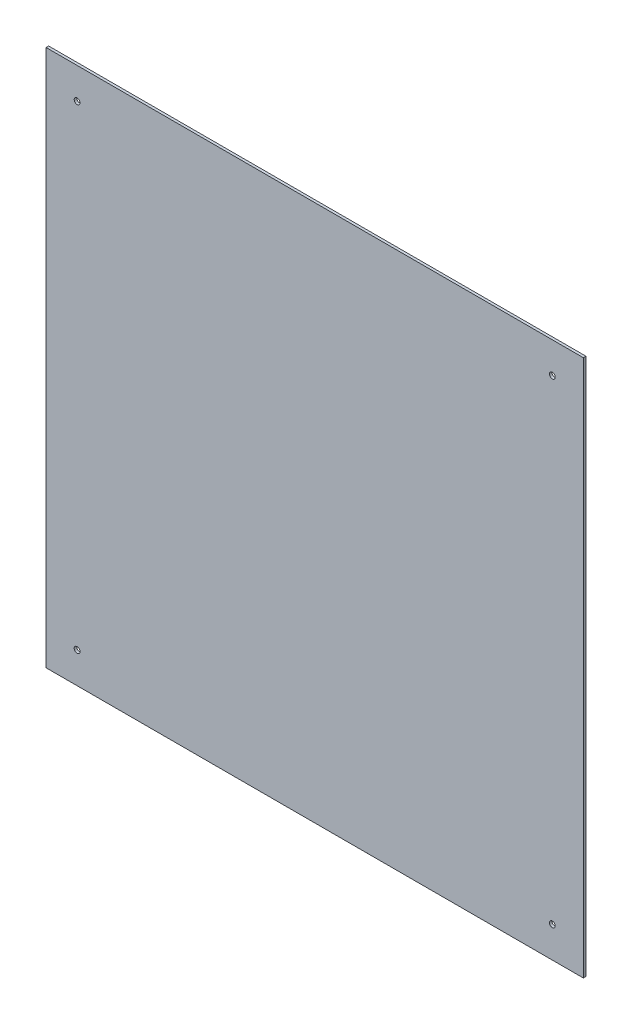
ISO-10303-21;
HEADER;
FILE_DESCRIPTION(('STEP AP214'),'2;1');
FILE_NAME('part.step','',(''),(''),'','','');
FILE_SCHEMA(('AUTOMOTIVE_DESIGN { 1 0 10303 214 1 1 1 1 }'));
ENDSEC;
DATA;
#1=APPLICATION_CONTEXT('core data for automotive mechanical design processes');
#2=APPLICATION_PROTOCOL_DEFINITION('international standard','automotive_design',2000,#1);
#3=PRODUCT_CONTEXT('',#1,'mechanical');
#4=PRODUCT('Part','Part','',(#3));
#5=PRODUCT_RELATED_PRODUCT_CATEGORY('part','',(#4));
#6=PRODUCT_DEFINITION_FORMATION('','',#4);
#7=PRODUCT_DEFINITION_CONTEXT('part definition',#1,'design');
#8=PRODUCT_DEFINITION('design','',#6,#7);
#9=PRODUCT_DEFINITION_SHAPE('','',#8);
#10=(LENGTH_UNIT() NAMED_UNIT(*) SI_UNIT(.MILLI.,.METRE.));
#11=(NAMED_UNIT(*) PLANE_ANGLE_UNIT() SI_UNIT($,.RADIAN.));
#12=(NAMED_UNIT(*) SI_UNIT($,.STERADIAN.) SOLID_ANGLE_UNIT());
#13=UNCERTAINTY_MEASURE_WITH_UNIT(LENGTH_MEASURE(1.E-05),#10,'distance_accuracy_value','');
#14=(GEOMETRIC_REPRESENTATION_CONTEXT(3) GLOBAL_UNCERTAINTY_ASSIGNED_CONTEXT((#13)) GLOBAL_UNIT_ASSIGNED_CONTEXT((#10,
#11,#12)) REPRESENTATION_CONTEXT('',''));
#15=CARTESIAN_POINT('',(0.,0.,0.));
#16=DIRECTION('',(0.,0.,1.));
#17=DIRECTION('',(1.,0.,0.));
#18=AXIS2_PLACEMENT_3D('',#15,#16,#17);
#19=CARTESIAN_POINT('',(0.,0.,3.175));
#20=DIRECTION('',(0.,0.,-1.));
#21=DIRECTION('',(-1.,0.,0.));
#22=AXIS2_PLACEMENT_3D('',#19,#20,#21);
#23=PLANE('',#22);
#24=DIRECTION('',(0.,-1.,0.));
#25=VECTOR('',#24,1.);
#26=CARTESIAN_POINT('',(0.,0.,3.175));
#27=LINE('',#26,#25);
#28=CARTESIAN_POINT('',(0.,660.4,3.175));
#29=VERTEX_POINT('',#28);
#30=CARTESIAN_POINT('',(0.,0.,3.175));
#31=VERTEX_POINT('',#30);
#32=EDGE_CURVE('E86',#29,#31,#27,.T.);
#33=ORIENTED_EDGE('',*,*,#32,.T.);
#34=DIRECTION('',(1.,0.,0.));
#35=VECTOR('',#34,1.);
#36=CARTESIAN_POINT('',(0.,0.,3.175));
#37=LINE('',#36,#35);
#38=CARTESIAN_POINT('',(660.4,0.,3.175));
#39=VERTEX_POINT('',#38);
#40=EDGE_CURVE('E81',#31,#39,#37,.T.);
#41=ORIENTED_EDGE('',*,*,#40,.T.);
#42=DIRECTION('',(0.,1.,0.));
#43=VECTOR('',#42,1.);
#44=CARTESIAN_POINT('',(660.4,0.,3.175));
#45=LINE('',#44,#43);
#46=CARTESIAN_POINT('',(660.4,660.4,3.175));
#47=VERTEX_POINT('',#46);
#48=EDGE_CURVE('E84',#39,#47,#45,.T.);
#49=ORIENTED_EDGE('',*,*,#48,.T.);
#50=DIRECTION('',(-1.,0.,0.));
#51=VECTOR('',#50,1.);
#52=CARTESIAN_POINT('',(0.,660.4,3.175));
#53=LINE('',#52,#51);
#54=EDGE_CURVE('E51',#47,#29,#53,.T.);
#55=ORIENTED_EDGE('',*,*,#54,.T.);
#56=EDGE_LOOP('',(#33,#41,#49,#55));
#57=FACE_BOUND('',#56,.T.);
#58=CARTESIAN_POINT('',(38.1,622.3,3.175));
#59=DIRECTION('',(0.,0.,1.));
#60=DIRECTION('',(1.,0.,0.));
#61=AXIS2_PLACEMENT_3D('',#58,#59,#60);
#62=CIRCLE('',#61,3.55600000000005);
#63=CARTESIAN_POINT('',(41.6560000000001,622.3,3.175));
#64=VERTEX_POINT('',#63);
#65=EDGE_CURVE('E101',#64,#64,#62,.T.);
#66=ORIENTED_EDGE('',*,*,#65,.F.);
#67=EDGE_LOOP('',(#66));
#68=FACE_BOUND('',#67,.T.);
#69=CARTESIAN_POINT('',(622.3,622.3,3.175));
#70=DIRECTION('',(0.,0.,1.));
#71=DIRECTION('',(1.,0.,0.));
#72=AXIS2_PLACEMENT_3D('',#69,#70,#71);
#73=CIRCLE('',#72,3.55599999999997);
#74=CARTESIAN_POINT('',(625.856,622.3,3.175));
#75=VERTEX_POINT('',#74);
#76=EDGE_CURVE('E116',#75,#75,#73,.T.);
#77=ORIENTED_EDGE('',*,*,#76,.F.);
#78=EDGE_LOOP('',(#77));
#79=FACE_BOUND('',#78,.T.);
#80=CARTESIAN_POINT('',(622.3,38.1,3.175));
#81=DIRECTION('',(0.,0.,1.));
#82=DIRECTION('',(1.,0.,0.));
#83=AXIS2_PLACEMENT_3D('',#80,#81,#82);
#84=CIRCLE('',#83,3.55599999999996);
#85=CARTESIAN_POINT('',(625.856,38.1,3.175));
#86=VERTEX_POINT('',#85);
#87=EDGE_CURVE('E122',#86,#86,#84,.T.);
#88=ORIENTED_EDGE('',*,*,#87,.F.);
#89=EDGE_LOOP('',(#88));
#90=FACE_BOUND('',#89,.T.);
#91=CARTESIAN_POINT('',(38.1,38.1,3.175));
#92=DIRECTION('',(0.,0.,1.));
#93=DIRECTION('',(1.,0.,0.));
#94=AXIS2_PLACEMENT_3D('',#91,#92,#93);
#95=CIRCLE('',#94,3.55600000000001);
#96=CARTESIAN_POINT('',(41.656,38.1,3.175));
#97=VERTEX_POINT('',#96);
#98=EDGE_CURVE('E128',#97,#97,#95,.T.);
#99=ORIENTED_EDGE('',*,*,#98,.F.);
#100=EDGE_LOOP('',(#99));
#101=FACE_BOUND('',#100,.T.);
#102=ADVANCED_FACE('F34',(#57,#68,#79,#90,#101),#23,.F.);
#103=CARTESIAN_POINT('',(0.,0.,0.));
#104=DIRECTION('',(0.,0.,-1.));
#105=DIRECTION('',(-1.,0.,0.));
#106=AXIS2_PLACEMENT_3D('',#103,#104,#105);
#107=PLANE('',#106);
#108=CARTESIAN_POINT('',(622.3,38.1,0.));
#109=DIRECTION('',(0.,0.,1.));
#110=DIRECTION('',(1.,0.,0.));
#111=AXIS2_PLACEMENT_3D('',#108,#109,#110);
#112=CIRCLE('',#111,3.55599999999996);
#113=CARTESIAN_POINT('',(625.856,38.1,0.));
#114=VERTEX_POINT('',#113);
#115=EDGE_CURVE('E125',#114,#114,#112,.T.);
#116=ORIENTED_EDGE('',*,*,#115,.T.);
#117=EDGE_LOOP('',(#116));
#118=FACE_BOUND('',#117,.T.);
#119=CARTESIAN_POINT('',(38.1,622.3,0.));
#120=DIRECTION('',(0.,0.,1.));
#121=DIRECTION('',(1.,0.,0.));
#122=AXIS2_PLACEMENT_3D('',#119,#120,#121);
#123=CIRCLE('',#122,3.55600000000005);
#124=CARTESIAN_POINT('',(41.6560000000001,622.3,0.));
#125=VERTEX_POINT('',#124);
#126=EDGE_CURVE('E113',#125,#125,#123,.T.);
#127=ORIENTED_EDGE('',*,*,#126,.T.);
#128=EDGE_LOOP('',(#127));
#129=FACE_BOUND('',#128,.T.);
#130=DIRECTION('',(0.,-1.,0.));
#131=VECTOR('',#130,1.);
#132=CARTESIAN_POINT('',(0.,0.,0.));
#133=LINE('',#132,#131);
#134=CARTESIAN_POINT('',(0.,660.4,0.));
#135=VERTEX_POINT('',#134);
#136=CARTESIAN_POINT('',(0.,0.,0.));
#137=VERTEX_POINT('',#136);
#138=EDGE_CURVE('E98',#135,#137,#133,.T.);
#139=ORIENTED_EDGE('',*,*,#138,.F.);
#140=DIRECTION('',(-1.,0.,0.));
#141=VECTOR('',#140,1.);
#142=CARTESIAN_POINT('',(0.,660.4,0.));
#143=LINE('',#142,#141);
#144=CARTESIAN_POINT('',(660.4,660.4,0.));
#145=VERTEX_POINT('',#144);
#146=EDGE_CURVE('E74',#145,#135,#143,.T.);
#147=ORIENTED_EDGE('',*,*,#146,.F.);
#148=DIRECTION('',(0.,1.,0.));
#149=VECTOR('',#148,1.);
#150=CARTESIAN_POINT('',(660.4,0.,0.));
#151=LINE('',#150,#149);
#152=CARTESIAN_POINT('',(660.4,0.,0.));
#153=VERTEX_POINT('',#152);
#154=EDGE_CURVE('E68',#153,#145,#151,.T.);
#155=ORIENTED_EDGE('',*,*,#154,.F.);
#156=DIRECTION('',(1.,0.,0.));
#157=VECTOR('',#156,1.);
#158=CARTESIAN_POINT('',(0.,0.,0.));
#159=LINE('',#158,#157);
#160=EDGE_CURVE('E90',#137,#153,#159,.T.);
#161=ORIENTED_EDGE('',*,*,#160,.F.);
#162=EDGE_LOOP('',(#139,#147,#155,#161));
#163=FACE_BOUND('',#162,.T.);
#164=CARTESIAN_POINT('',(622.3,622.3,0.));
#165=DIRECTION('',(0.,0.,1.));
#166=DIRECTION('',(1.,0.,0.));
#167=AXIS2_PLACEMENT_3D('',#164,#165,#166);
#168=CIRCLE('',#167,3.55599999999997);
#169=CARTESIAN_POINT('',(625.856,622.3,0.));
#170=VERTEX_POINT('',#169);
#171=EDGE_CURVE('E119',#170,#170,#168,.T.);
#172=ORIENTED_EDGE('',*,*,#171,.T.);
#173=EDGE_LOOP('',(#172));
#174=FACE_BOUND('',#173,.T.);
#175=CARTESIAN_POINT('',(38.1,38.1,0.));
#176=DIRECTION('',(0.,0.,1.));
#177=DIRECTION('',(1.,0.,0.));
#178=AXIS2_PLACEMENT_3D('',#175,#176,#177);
#179=CIRCLE('',#178,3.55600000000001);
#180=CARTESIAN_POINT('',(41.656,38.1,0.));
#181=VERTEX_POINT('',#180);
#182=EDGE_CURVE('E131',#181,#181,#179,.T.);
#183=ORIENTED_EDGE('',*,*,#182,.T.);
#184=EDGE_LOOP('',(#183));
#185=FACE_BOUND('',#184,.T.);
#186=ADVANCED_FACE('F109',(#118,#129,#163,#174,#185),#107,.T.);
#187=CARTESIAN_POINT('',(0.,0.,3.175));
#188=DIRECTION('',(1.,0.,0.));
#189=DIRECTION('',(0.,0.,-1.));
#190=AXIS2_PLACEMENT_3D('',#187,#188,#189);
#191=PLANE('',#190);
#192=ORIENTED_EDGE('',*,*,#138,.T.);
#193=DIRECTION('',(0.,0.,-1.));
#194=VECTOR('',#193,1.);
#195=CARTESIAN_POINT('',(0.,0.,3.175));
#196=LINE('',#195,#194);
#197=EDGE_CURVE('E11',#31,#137,#196,.T.);
#198=ORIENTED_EDGE('',*,*,#197,.F.);
#199=ORIENTED_EDGE('',*,*,#32,.F.);
#200=DIRECTION('',(0.,0.,-1.));
#201=VECTOR('',#200,1.);
#202=CARTESIAN_POINT('',(0.,660.4,3.175));
#203=LINE('',#202,#201);
#204=EDGE_CURVE('E94',#29,#135,#203,.T.);
#205=ORIENTED_EDGE('',*,*,#204,.T.);
#206=EDGE_LOOP('',(#192,#198,#199,#205));
#207=FACE_BOUND('',#206,.T.);
#208=ADVANCED_FACE('F36',(#207),#191,.F.);
#209=CARTESIAN_POINT('',(0.,0.,3.175));
#210=DIRECTION('',(0.,1.,0.));
#211=DIRECTION('',(0.,0.,1.));
#212=AXIS2_PLACEMENT_3D('',#209,#210,#211);
#213=PLANE('',#212);
#214=ORIENTED_EDGE('',*,*,#160,.T.);
#215=DIRECTION('',(0.,0.,-1.));
#216=VECTOR('',#215,1.);
#217=CARTESIAN_POINT('',(660.4,0.,3.175));
#218=LINE('',#217,#216);
#219=EDGE_CURVE('E43',#39,#153,#218,.T.);
#220=ORIENTED_EDGE('',*,*,#219,.F.);
#221=ORIENTED_EDGE('',*,*,#40,.F.);
#222=ORIENTED_EDGE('',*,*,#197,.T.);
#223=EDGE_LOOP('',(#214,#220,#221,#222));
#224=FACE_BOUND('',#223,.T.);
#225=ADVANCED_FACE('F89',(#224),#213,.F.);
#226=CARTESIAN_POINT('',(660.4,0.,3.175));
#227=DIRECTION('',(-1.,0.,0.));
#228=DIRECTION('',(0.,0.,1.));
#229=AXIS2_PLACEMENT_3D('',#226,#227,#228);
#230=PLANE('',#229);
#231=ORIENTED_EDGE('',*,*,#154,.T.);
#232=DIRECTION('',(0.,0.,-1.));
#233=VECTOR('',#232,1.);
#234=CARTESIAN_POINT('',(660.4,660.4,3.175));
#235=LINE('',#234,#233);
#236=EDGE_CURVE('E91',#47,#145,#235,.T.);
#237=ORIENTED_EDGE('',*,*,#236,.F.);
#238=ORIENTED_EDGE('',*,*,#48,.F.);
#239=ORIENTED_EDGE('',*,*,#219,.T.);
#240=EDGE_LOOP('',(#231,#237,#238,#239));
#241=FACE_BOUND('',#240,.T.);
#242=ADVANCED_FACE('F92',(#241),#230,.F.);
#243=CARTESIAN_POINT('',(0.,660.4,3.175));
#244=DIRECTION('',(0.,-1.,0.));
#245=DIRECTION('',(0.,0.,-1.));
#246=AXIS2_PLACEMENT_3D('',#243,#244,#245);
#247=PLANE('',#246);
#248=ORIENTED_EDGE('',*,*,#146,.T.);
#249=ORIENTED_EDGE('',*,*,#204,.F.);
#250=ORIENTED_EDGE('',*,*,#54,.F.);
#251=ORIENTED_EDGE('',*,*,#236,.T.);
#252=EDGE_LOOP('',(#248,#249,#250,#251));
#253=FACE_BOUND('',#252,.T.);
#254=ADVANCED_FACE('F106',(#253),#247,.F.);
#255=CARTESIAN_POINT('',(38.1,622.3,3.175));
#256=DIRECTION('',(0.,0.,-1.));
#257=DIRECTION('',(-1.,0.,0.));
#258=AXIS2_PLACEMENT_3D('',#255,#256,#257);
#259=CYLINDRICAL_SURFACE('',#258,3.55600000000005);
#260=ORIENTED_EDGE('',*,*,#65,.T.);
#261=EDGE_LOOP('',(#260));
#262=FACE_BOUND('',#261,.T.);
#263=ORIENTED_EDGE('',*,*,#126,.F.);
#264=EDGE_LOOP('',(#263));
#265=FACE_BOUND('',#264,.T.);
#266=ADVANCED_FACE('F148',(#262,#265),#259,.F.);
#267=CARTESIAN_POINT('',(622.3,622.3,3.175));
#268=DIRECTION('',(0.,0.,-1.));
#269=DIRECTION('',(-1.,0.,0.));
#270=AXIS2_PLACEMENT_3D('',#267,#268,#269);
#271=CYLINDRICAL_SURFACE('',#270,3.55599999999997);
#272=ORIENTED_EDGE('',*,*,#76,.T.);
#273=EDGE_LOOP('',(#272));
#274=FACE_BOUND('',#273,.T.);
#275=ORIENTED_EDGE('',*,*,#171,.F.);
#276=EDGE_LOOP('',(#275));
#277=FACE_BOUND('',#276,.T.);
#278=ADVANCED_FACE('F198',(#274,#277),#271,.F.);
#279=CARTESIAN_POINT('',(622.3,38.1,3.175));
#280=DIRECTION('',(0.,0.,-1.));
#281=DIRECTION('',(-1.,0.,0.));
#282=AXIS2_PLACEMENT_3D('',#279,#280,#281);
#283=CYLINDRICAL_SURFACE('',#282,3.55599999999996);
#284=ORIENTED_EDGE('',*,*,#87,.T.);
#285=EDGE_LOOP('',(#284));
#286=FACE_BOUND('',#285,.T.);
#287=ORIENTED_EDGE('',*,*,#115,.F.);
#288=EDGE_LOOP('',(#287));
#289=FACE_BOUND('',#288,.T.);
#290=ADVANCED_FACE('F206',(#286,#289),#283,.F.);
#291=CARTESIAN_POINT('',(38.1,38.1,3.175));
#292=DIRECTION('',(0.,0.,-1.));
#293=DIRECTION('',(-1.,0.,0.));
#294=AXIS2_PLACEMENT_3D('',#291,#292,#293);
#295=CYLINDRICAL_SURFACE('',#294,3.55600000000001);
#296=ORIENTED_EDGE('',*,*,#98,.T.);
#297=EDGE_LOOP('',(#296));
#298=FACE_BOUND('',#297,.T.);
#299=ORIENTED_EDGE('',*,*,#182,.F.);
#300=EDGE_LOOP('',(#299));
#301=FACE_BOUND('',#300,.T.);
#302=ADVANCED_FACE('F137',(#298,#301),#295,.F.);
#303=CLOSED_SHELL('',(#102,#186,#208,#225,#242,#254,#266,#278,#290,#302));
#304=MANIFOLD_SOLID_BREP('B2',#303);
#305=ADVANCED_BREP_SHAPE_REPRESENTATION('',(#18,#304),#14);
#306=SHAPE_DEFINITION_REPRESENTATION(#9,#305);
ENDSEC;
END-ISO-10303-21;
